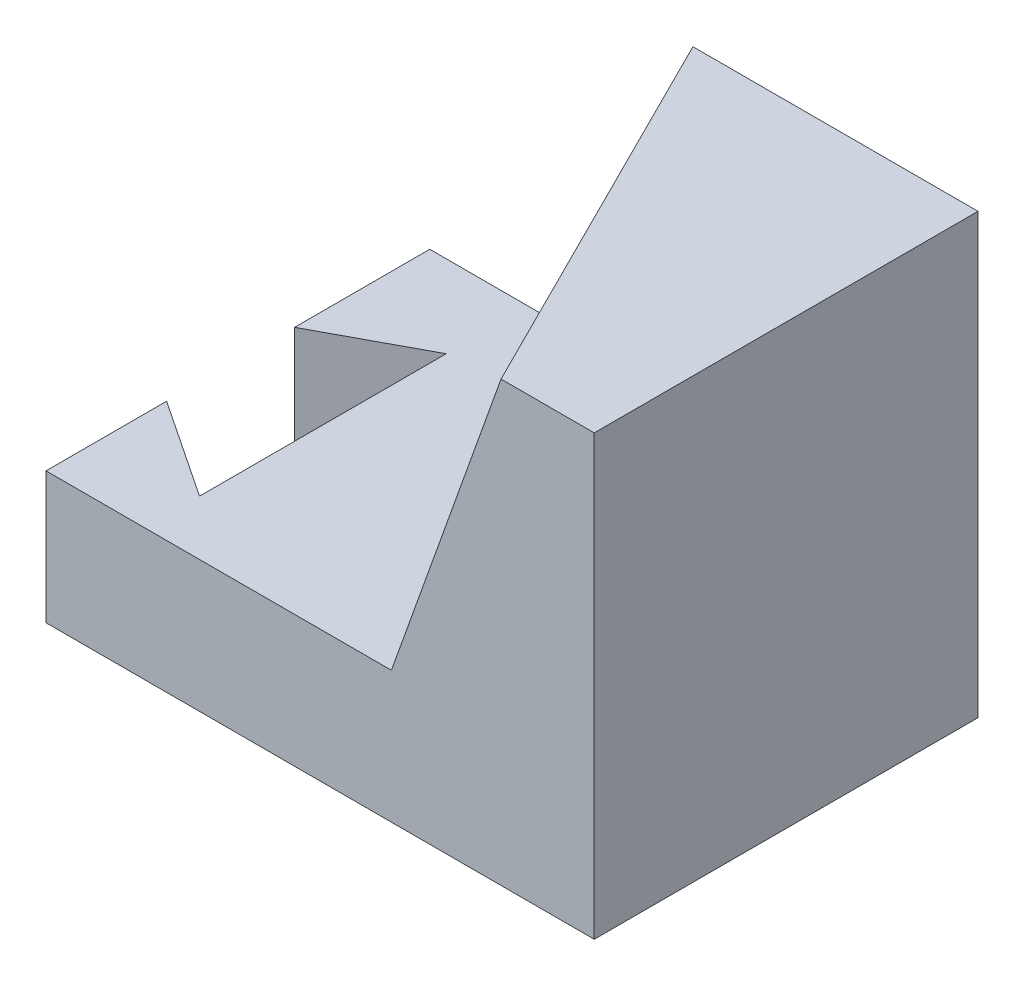
ISO-10303-21;
HEADER;
FILE_DESCRIPTION(('STEP AP214'),'2;1');
FILE_NAME('part.step','',(''),(''),'','','');
FILE_SCHEMA(('AUTOMOTIVE_DESIGN { 1 0 10303 214 1 1 1 1 }'));
ENDSEC;
DATA;
#1=APPLICATION_CONTEXT('core data for automotive mechanical design processes');
#2=APPLICATION_PROTOCOL_DEFINITION('international standard','automotive_design',2000,#1);
#3=PRODUCT_CONTEXT('',#1,'mechanical');
#4=PRODUCT('Part','Part','',(#3));
#5=PRODUCT_RELATED_PRODUCT_CATEGORY('part','',(#4));
#6=PRODUCT_DEFINITION_FORMATION('','',#4);
#7=PRODUCT_DEFINITION_CONTEXT('part definition',#1,'design');
#8=PRODUCT_DEFINITION('design','',#6,#7);
#9=PRODUCT_DEFINITION_SHAPE('','',#8);
#10=(LENGTH_UNIT() NAMED_UNIT(*) SI_UNIT(.MILLI.,.METRE.));
#11=(NAMED_UNIT(*) PLANE_ANGLE_UNIT() SI_UNIT($,.RADIAN.));
#12=(NAMED_UNIT(*) SI_UNIT($,.STERADIAN.) SOLID_ANGLE_UNIT());
#13=UNCERTAINTY_MEASURE_WITH_UNIT(LENGTH_MEASURE(1.E-05),#10,'distance_accuracy_value','');
#14=(GEOMETRIC_REPRESENTATION_CONTEXT(3) GLOBAL_UNCERTAINTY_ASSIGNED_CONTEXT((#13)) GLOBAL_UNIT_ASSIGNED_CONTEXT((#10,
#11,#12)) REPRESENTATION_CONTEXT('',''));
#15=CARTESIAN_POINT('',(0.,0.,0.));
#16=DIRECTION('',(0.,0.,1.));
#17=DIRECTION('',(1.,0.,0.));
#18=AXIS2_PLACEMENT_3D('',#15,#16,#17);
#19=CARTESIAN_POINT('',(0.,0.,0.));
#20=DIRECTION('',(1.,0.,0.));
#21=DIRECTION('',(0.,0.,-1.));
#22=AXIS2_PLACEMENT_3D('',#19,#20,#21);
#23=PLANE('',#22);
#24=CARTESIAN_POINT('',(0.,0.,0.));
#25=DIRECTION('',(0.,0.,1.));
#26=VECTOR('',#25,1.);
#27=LINE('',#24,#26);
#28=CARTESIAN_POINT('',(0.,0.,0.));
#29=VERTEX_POINT('',#28);
#30=CARTESIAN_POINT('',(0.,0.,24.6521739127826));
#31=VERTEX_POINT('',#30);
#32=EDGE_CURVE('E192',#29,#31,#27,.T.);
#33=ORIENTED_EDGE('',*,*,#32,.T.);
#34=DIRECTION('',(0.,1.,0.));
#35=VECTOR('',#34,1.);
#36=CARTESIAN_POINT('',(0.,0.,24.6521739127826));
#37=LINE('',#36,#35);
#38=CARTESIAN_POINT('',(0.,24.,24.6521739127826));
#39=VERTEX_POINT('',#38);
#40=EDGE_CURVE('E156',#31,#39,#37,.T.);
#41=ORIENTED_EDGE('',*,*,#40,.T.);
#42=CARTESIAN_POINT('',(0.,24.,0.));
#43=DIRECTION('',(0.,0.,1.));
#44=VECTOR('',#43,1.);
#45=LINE('',#42,#44);
#46=CARTESIAN_POINT('',(0.,24.,0.));
#47=VERTEX_POINT('',#46);
#48=EDGE_CURVE('E541',#47,#39,#45,.T.);
#49=ORIENTED_EDGE('',*,*,#48,.F.);
#50=DIRECTION('',(0.,-1.,0.));
#51=VECTOR('',#50,1.);
#52=CARTESIAN_POINT('',(0.,24.,0.));
#53=LINE('',#52,#51);
#54=EDGE_CURVE('E161',#47,#29,#53,.T.);
#55=ORIENTED_EDGE('',*,*,#54,.T.);
#56=EDGE_LOOP('',(#33,#41,#49,#55));
#57=FACE_BOUND('',#56,.T.);
#58=ADVANCED_FACE('F65',(#57),#23,.F.);
#59=CARTESIAN_POINT('',(0.,0.,70.));
#60=DIRECTION('',(0.,0.,1.));
#61=DIRECTION('',(1.,0.,0.));
#62=AXIS2_PLACEMENT_3D('',#59,#60,#61);
#63=PLANE('',#62);
#64=DIRECTION('',(0.,-1.,0.));
#65=VECTOR('',#64,1.);
#66=CARTESIAN_POINT('',(0.,24.,70.));
#67=LINE('',#66,#65);
#68=CARTESIAN_POINT('',(0.,24.,70.));
#69=VERTEX_POINT('',#68);
#70=CARTESIAN_POINT('',(0.,0.,70.));
#71=VERTEX_POINT('',#70);
#72=EDGE_CURVE('E349',#69,#71,#67,.T.);
#73=ORIENTED_EDGE('',*,*,#72,.T.);
#74=DIRECTION('',(1.,0.,0.));
#75=VECTOR('',#74,1.);
#76=CARTESIAN_POINT('',(0.,0.,70.));
#77=LINE('',#76,#75);
#78=CARTESIAN_POINT('',(100.,0.,70.));
#79=VERTEX_POINT('',#78);
#80=EDGE_CURVE('E360',#71,#79,#77,.T.);
#81=ORIENTED_EDGE('',*,*,#80,.T.);
#82=DIRECTION('',(0.,1.,0.));
#83=VECTOR('',#82,1.);
#84=CARTESIAN_POINT('',(100.,0.,70.));
#85=LINE('',#84,#83);
#86=CARTESIAN_POINT('',(100.,80.,70.));
#87=VERTEX_POINT('',#86);
#88=EDGE_CURVE('E370',#79,#87,#85,.T.);
#89=ORIENTED_EDGE('',*,*,#88,.T.);
#90=DIRECTION('',(-1.,0.,0.));
#91=VECTOR('',#90,1.);
#92=CARTESIAN_POINT('',(100.,80.,70.));
#93=LINE('',#92,#91);
#94=CARTESIAN_POINT('',(83.,80.,70.));
#95=VERTEX_POINT('',#94);
#96=EDGE_CURVE('E380',#87,#95,#93,.T.);
#97=ORIENTED_EDGE('',*,*,#96,.T.);
#98=DIRECTION('',(-0.336336396998156,-0.941741911594837,0.));
#99=VECTOR('',#98,1.);
#100=CARTESIAN_POINT('',(83.,80.,70.));
#101=LINE('',#100,#99);
#102=CARTESIAN_POINT('',(63.,24.,70.));
#103=VERTEX_POINT('',#102);
#104=EDGE_CURVE('E389',#95,#103,#101,.T.);
#105=ORIENTED_EDGE('',*,*,#104,.T.);
#106=DIRECTION('',(-1.,0.,0.));
#107=VECTOR('',#106,1.);
#108=CARTESIAN_POINT('',(63.,24.,70.));
#109=LINE('',#108,#107);
#110=EDGE_CURVE('E335',#103,#69,#109,.T.);
#111=ORIENTED_EDGE('',*,*,#110,.T.);
#112=EDGE_LOOP('',(#73,#81,#89,#97,#105,#111));
#113=FACE_BOUND('',#112,.T.);
#114=ADVANCED_FACE('F67',(#113),#63,.T.);
#115=CARTESIAN_POINT('',(0.,0.,0.));
#116=DIRECTION('',(0.,0.,1.));
#117=DIRECTION('',(1.,0.,0.));
#118=AXIS2_PLACEMENT_3D('',#115,#116,#117);
#119=PLANE('',#118);
#120=ORIENTED_EDGE('',*,*,#54,.F.);
#121=DIRECTION('',(-1.,0.,0.));
#122=VECTOR('',#121,1.);
#123=CARTESIAN_POINT('',(28.,24.,0.));
#124=LINE('',#123,#122);
#125=CARTESIAN_POINT('',(28.,24.,0.));
#126=VERTEX_POINT('',#125);
#127=EDGE_CURVE('E402',#126,#47,#124,.T.);
#128=ORIENTED_EDGE('',*,*,#127,.F.);
#129=DIRECTION('',(-0.336336396998156,-0.941741911594837,0.));
#130=VECTOR('',#129,1.);
#131=CARTESIAN_POINT('',(48.,80.,0.));
#132=LINE('',#131,#130);
#133=CARTESIAN_POINT('',(48.,80.,0.));
#134=VERTEX_POINT('',#133);
#135=EDGE_CURVE('E407',#134,#126,#132,.T.);
#136=ORIENTED_EDGE('',*,*,#135,.F.);
#137=DIRECTION('',(-1.,0.,0.));
#138=VECTOR('',#137,1.);
#139=CARTESIAN_POINT('',(100.,80.,0.));
#140=LINE('',#139,#138);
#141=CARTESIAN_POINT('',(100.,80.,0.));
#142=VERTEX_POINT('',#141);
#143=EDGE_CURVE('E424',#142,#134,#140,.T.);
#144=ORIENTED_EDGE('',*,*,#143,.F.);
#145=DIRECTION('',(0.,1.,0.));
#146=VECTOR('',#145,1.);
#147=CARTESIAN_POINT('',(100.,0.,0.));
#148=LINE('',#147,#146);
#149=CARTESIAN_POINT('',(100.,0.,0.));
#150=VERTEX_POINT('',#149);
#151=EDGE_CURVE('E238',#150,#142,#148,.T.);
#152=ORIENTED_EDGE('',*,*,#151,.F.);
#153=DIRECTION('',(1.,0.,0.));
#154=VECTOR('',#153,1.);
#155=CARTESIAN_POINT('',(0.,0.,0.));
#156=LINE('',#155,#154);
#157=EDGE_CURVE('E442',#29,#150,#156,.T.);
#158=ORIENTED_EDGE('',*,*,#157,.F.);
#159=EDGE_LOOP('',(#120,#128,#136,#144,#152,#158));
#160=FACE_BOUND('',#159,.T.);
#161=ADVANCED_FACE('F210',(#160),#119,.F.);
#162=CARTESIAN_POINT('',(0.,0.,0.));
#163=DIRECTION('',(0.,1.,0.));
#164=DIRECTION('',(0.,0.,1.));
#165=AXIS2_PLACEMENT_3D('',#162,#163,#164);
#166=PLANE('',#165);
#167=DIRECTION('',(0.,0.,-1.));
#168=VECTOR('',#167,1.);
#169=CARTESIAN_POINT('',(18.,0.,0.));
#170=LINE('',#169,#168);
#171=CARTESIAN_POINT('',(18.,0.,60.));
#172=VERTEX_POINT('',#171);
#173=CARTESIAN_POINT('',(18.,0.,15.));
#174=VERTEX_POINT('',#173);
#175=EDGE_CURVE('E165',#172,#174,#170,.T.);
#176=ORIENTED_EDGE('',*,*,#175,.T.);
#177=DIRECTION('',(-0.881290022872121,0.,0.472575809353438));
#178=VECTOR('',#177,1.);
#179=CARTESIAN_POINT('',(10.2670473080575,0.,19.1466557912194));
#180=LINE('',#179,#178);
#181=EDGE_CURVE('E150',#174,#31,#180,.T.);
#182=ORIENTED_EDGE('',*,*,#181,.T.);
#183=ORIENTED_EDGE('',*,*,#32,.F.);
#184=ORIENTED_EDGE('',*,*,#157,.T.);
#185=CARTESIAN_POINT('',(100.,0.,0.));
#186=DIRECTION('',(0.,0.,1.));
#187=VECTOR('',#186,1.);
#188=LINE('',#185,#187);
#189=EDGE_CURVE('E406',#150,#79,#188,.T.);
#190=ORIENTED_EDGE('',*,*,#189,.T.);
#191=ORIENTED_EDGE('',*,*,#80,.F.);
#192=CARTESIAN_POINT('',(0.,0.,48.0000000002609));
#193=DIRECTION('',(0.,0.,1.));
#194=VECTOR('',#193,1.);
#195=LINE('',#192,#194);
#196=CARTESIAN_POINT('',(0.,0.,48.0000000002609));
#197=VERTEX_POINT('',#196);
#198=EDGE_CURVE('E560',#197,#71,#195,.T.);
#199=ORIENTED_EDGE('',*,*,#198,.F.);
#200=DIRECTION('',(0.832050294343409,0.,0.554700196216881));
#201=VECTOR('',#200,1.);
#202=CARTESIAN_POINT('',(-22.1538461537813,0.,33.2307692313944));
#203=LINE('',#202,#201);
#204=EDGE_CURVE('E171',#197,#172,#203,.T.);
#205=ORIENTED_EDGE('',*,*,#204,.T.);
#206=EDGE_LOOP('',(#176,#182,#183,#184,#190,#191,#199,#205));
#207=FACE_BOUND('',#206,.T.);
#208=ADVANCED_FACE('F170',(#207),#166,.F.);
#209=CARTESIAN_POINT('',(0.,24.,48.0000000002609));
#210=DIRECTION('',(0.,0.,1.));
#211=VECTOR('',#210,1.);
#212=LINE('',#209,#211);
#213=CARTESIAN_POINT('',(0.,24.,48.0000000002609));
#214=VERTEX_POINT('',#213);
#215=EDGE_CURVE('E93',#214,#69,#212,.T.);
#216=ORIENTED_EDGE('',*,*,#215,.F.);
#217=DIRECTION('',(0.,-1.,0.));
#218=VECTOR('',#217,1.);
#219=CARTESIAN_POINT('',(0.,0.,48.0000000002609));
#220=LINE('',#219,#218);
#221=EDGE_CURVE('E172',#214,#197,#220,.T.);
#222=ORIENTED_EDGE('',*,*,#221,.T.);
#223=ORIENTED_EDGE('',*,*,#198,.T.);
#224=ORIENTED_EDGE('',*,*,#72,.F.);
#225=EDGE_LOOP('',(#216,#222,#223,#224));
#226=FACE_BOUND('',#225,.T.);
#227=ADVANCED_FACE('F209',(#226),#23,.F.);
#228=CARTESIAN_POINT('',(100.,0.,0.));
#229=DIRECTION('',(-1.,0.,0.));
#230=DIRECTION('',(0.,0.,1.));
#231=AXIS2_PLACEMENT_3D('',#228,#229,#230);
#232=PLANE('',#231);
#233=CARTESIAN_POINT('',(100.,80.,0.));
#234=DIRECTION('',(0.,0.,1.));
#235=VECTOR('',#234,1.);
#236=LINE('',#233,#235);
#237=EDGE_CURVE('E277',#142,#87,#236,.T.);
#238=ORIENTED_EDGE('',*,*,#237,.T.);
#239=ORIENTED_EDGE('',*,*,#88,.F.);
#240=ORIENTED_EDGE('',*,*,#189,.F.);
#241=ORIENTED_EDGE('',*,*,#151,.T.);
#242=EDGE_LOOP('',(#238,#239,#240,#241));
#243=FACE_BOUND('',#242,.T.);
#244=ADVANCED_FACE('F245',(#243),#232,.F.);
#245=CARTESIAN_POINT('',(0.,80.,0.));
#246=DIRECTION('',(0.,-1.,0.));
#247=DIRECTION('',(0.,0.,-1.));
#248=AXIS2_PLACEMENT_3D('',#245,#246,#247);
#249=PLANE('',#248);
#250=CARTESIAN_POINT('',(48.,80.,0.));
#251=DIRECTION('',(0.447213595499958,0.,0.894427190999916));
#252=VECTOR('',#251,1.);
#253=LINE('',#250,#252);
#254=EDGE_CURVE('E289',#134,#95,#253,.T.);
#255=ORIENTED_EDGE('',*,*,#254,.T.);
#256=ORIENTED_EDGE('',*,*,#96,.F.);
#257=ORIENTED_EDGE('',*,*,#237,.F.);
#258=ORIENTED_EDGE('',*,*,#143,.T.);
#259=EDGE_LOOP('',(#255,#256,#257,#258));
#260=FACE_BOUND('',#259,.T.);
#261=ADVANCED_FACE('F254',(#260),#249,.F.);
#262=CARTESIAN_POINT('',(14.1037037037037,-5.03703703703703,-7.05185185185185));
#263=DIRECTION('',(0.852012867230258,-0.304290309725092,-0.426006433615129));
#264=DIRECTION('',(-0.447213595499958,0.,-0.894427190999916));
#265=AXIS2_PLACEMENT_3D('',#262,#263,#264);
#266=PLANE('',#265);
#267=CARTESIAN_POINT('',(28.,24.,0.));
#268=DIRECTION('',(0.447213595499958,0.,0.894427190999916));
#269=VECTOR('',#268,1.);
#270=LINE('',#267,#269);
#271=EDGE_CURVE('E568',#126,#103,#270,.T.);
#272=ORIENTED_EDGE('',*,*,#271,.T.);
#273=ORIENTED_EDGE('',*,*,#104,.F.);
#274=ORIENTED_EDGE('',*,*,#254,.F.);
#275=ORIENTED_EDGE('',*,*,#135,.T.);
#276=EDGE_LOOP('',(#272,#273,#274,#275));
#277=FACE_BOUND('',#276,.T.);
#278=ADVANCED_FACE('F306',(#277),#266,.F.);
#279=CARTESIAN_POINT('',(0.,24.,0.));
#280=DIRECTION('',(0.,-1.,0.));
#281=DIRECTION('',(0.,0.,-1.));
#282=AXIS2_PLACEMENT_3D('',#279,#280,#281);
#283=PLANE('',#282);
#284=ORIENTED_EDGE('',*,*,#48,.T.);
#285=DIRECTION('',(0.881290022872121,0.,-0.472575809353438));
#286=VECTOR('',#285,1.);
#287=CARTESIAN_POINT('',(10.2670473080575,24.,19.1466557912194));
#288=LINE('',#287,#286);
#289=CARTESIAN_POINT('',(18.,24.,15.));
#290=VERTEX_POINT('',#289);
#291=EDGE_CURVE('E12',#39,#290,#288,.T.);
#292=ORIENTED_EDGE('',*,*,#291,.T.);
#293=DIRECTION('',(0.,0.,1.));
#294=VECTOR('',#293,1.);
#295=CARTESIAN_POINT('',(18.,24.,0.));
#296=LINE('',#295,#294);
#297=CARTESIAN_POINT('',(18.,24.,60.));
#298=VERTEX_POINT('',#297);
#299=EDGE_CURVE('E167',#290,#298,#296,.T.);
#300=ORIENTED_EDGE('',*,*,#299,.T.);
#301=DIRECTION('',(-0.832050294343409,0.,-0.554700196216881));
#302=VECTOR('',#301,1.);
#303=CARTESIAN_POINT('',(-22.1538461537813,24.,33.2307692313944));
#304=LINE('',#303,#302);
#305=EDGE_CURVE('E76',#298,#214,#304,.T.);
#306=ORIENTED_EDGE('',*,*,#305,.T.);
#307=ORIENTED_EDGE('',*,*,#215,.T.);
#308=ORIENTED_EDGE('',*,*,#110,.F.);
#309=ORIENTED_EDGE('',*,*,#271,.F.);
#310=ORIENTED_EDGE('',*,*,#127,.T.);
#311=EDGE_LOOP('',(#284,#292,#300,#306,#307,#308,#309,#310));
#312=FACE_BOUND('',#311,.T.);
#313=ADVANCED_FACE('F314',(#312),#283,.F.);
#314=CARTESIAN_POINT('',(10.2670473080575,0.,19.1466557912194));
#315=DIRECTION('',(-0.472575809353438,0.,-0.881290022872121));
#316=DIRECTION('',(-0.881290022872121,0.,0.472575809353438));
#317=AXIS2_PLACEMENT_3D('',#314,#315,#316);
#318=PLANE('',#317);
#319=CARTESIAN_POINT('',(18.,0.,15.));
#320=DIRECTION('',(0.,1.,0.));
#321=VECTOR('',#320,1.);
#322=LINE('',#319,#321);
#323=EDGE_CURVE('E153',#174,#290,#322,.T.);
#324=ORIENTED_EDGE('',*,*,#323,.T.);
#325=ORIENTED_EDGE('',*,*,#291,.F.);
#326=ORIENTED_EDGE('',*,*,#40,.F.);
#327=ORIENTED_EDGE('',*,*,#181,.F.);
#328=EDGE_LOOP('',(#324,#325,#326,#327));
#329=FACE_BOUND('',#328,.T.);
#330=ADVANCED_FACE('F152',(#329),#318,.F.);
#331=CARTESIAN_POINT('',(-22.1538461537813,0.,33.2307692313944));
#332=DIRECTION('',(-0.554700196216881,0.,0.832050294343409));
#333=DIRECTION('',(0.832050294343409,0.,0.554700196216881));
#334=AXIS2_PLACEMENT_3D('',#331,#332,#333);
#335=PLANE('',#334);
#336=ORIENTED_EDGE('',*,*,#221,.F.);
#337=ORIENTED_EDGE('',*,*,#305,.F.);
#338=CARTESIAN_POINT('',(18.,0.,60.));
#339=DIRECTION('',(0.,1.,0.));
#340=VECTOR('',#339,1.);
#341=LINE('',#338,#340);
#342=EDGE_CURVE('E84',#172,#298,#341,.T.);
#343=ORIENTED_EDGE('',*,*,#342,.F.);
#344=ORIENTED_EDGE('',*,*,#204,.F.);
#345=EDGE_LOOP('',(#336,#337,#343,#344));
#346=FACE_BOUND('',#345,.T.);
#347=ADVANCED_FACE('F597',(#346),#335,.F.);
#348=CARTESIAN_POINT('',(18.,0.,0.));
#349=DIRECTION('',(1.,0.,0.));
#350=DIRECTION('',(0.,0.,-1.));
#351=AXIS2_PLACEMENT_3D('',#348,#349,#350);
#352=PLANE('',#351);
#353=ORIENTED_EDGE('',*,*,#342,.T.);
#354=ORIENTED_EDGE('',*,*,#299,.F.);
#355=ORIENTED_EDGE('',*,*,#323,.F.);
#356=ORIENTED_EDGE('',*,*,#175,.F.);
#357=EDGE_LOOP('',(#353,#354,#355,#356));
#358=FACE_BOUND('',#357,.T.);
#359=ADVANCED_FACE('F164',(#358),#352,.F.);
#360=CLOSED_SHELL('',(#58,#114,#161,#208,#227,#244,#261,#278,#313,#330,#347,#359));
#361=MANIFOLD_SOLID_BREP('B2',#360);
#362=ADVANCED_BREP_SHAPE_REPRESENTATION('',(#18,#361),#14);
#363=SHAPE_DEFINITION_REPRESENTATION(#9,#362);
ENDSEC;
END-ISO-10303-21;
